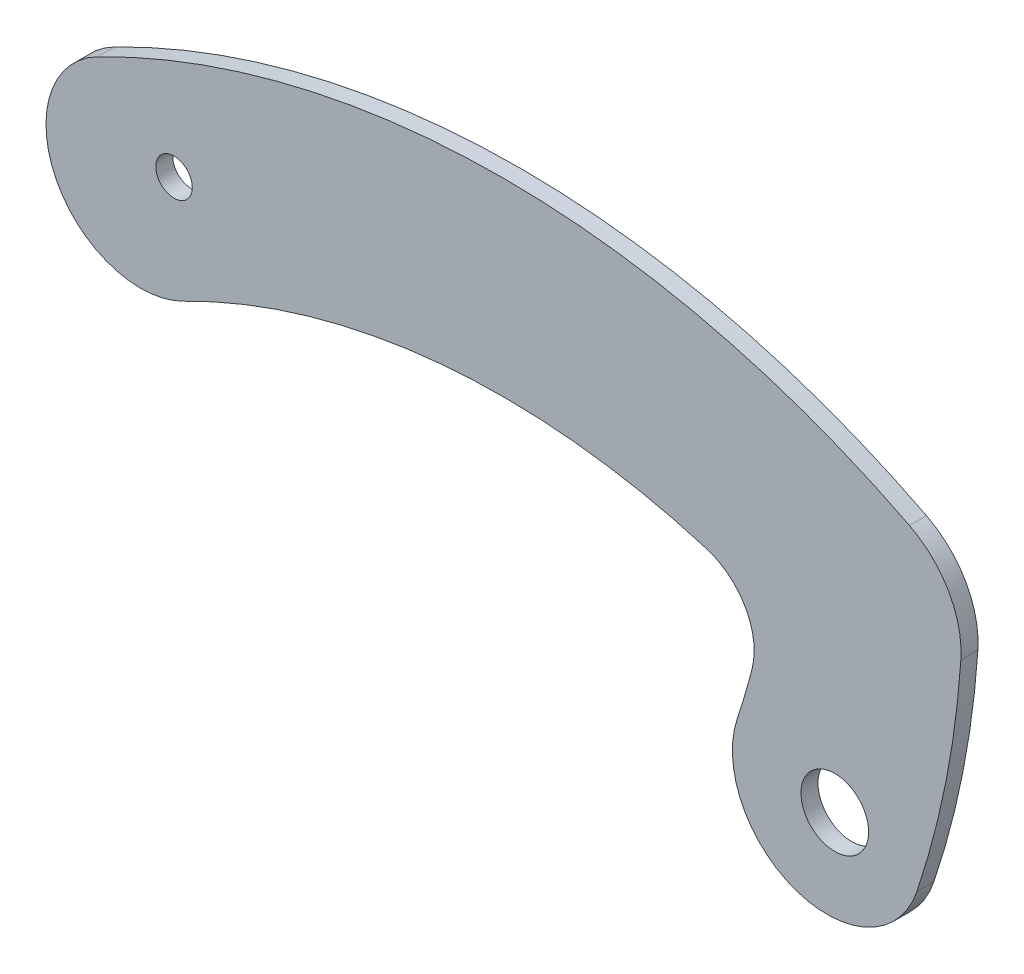
ISO-10303-21;
HEADER;
FILE_DESCRIPTION(('STEP AP214'),'2;1');
FILE_NAME('part.step','',(''),(''),'','','');
FILE_SCHEMA(('AUTOMOTIVE_DESIGN { 1 0 10303 214 1 1 1 1 }'));
ENDSEC;
DATA;
#1=APPLICATION_CONTEXT('core data for automotive mechanical design processes');
#2=APPLICATION_PROTOCOL_DEFINITION('international standard','automotive_design',2000,#1);
#3=PRODUCT_CONTEXT('',#1,'mechanical');
#4=PRODUCT('Part','Part','',(#3));
#5=PRODUCT_RELATED_PRODUCT_CATEGORY('part','',(#4));
#6=PRODUCT_DEFINITION_FORMATION('','',#4);
#7=PRODUCT_DEFINITION_CONTEXT('part definition',#1,'design');
#8=PRODUCT_DEFINITION('design','',#6,#7);
#9=PRODUCT_DEFINITION_SHAPE('','',#8);
#10=(LENGTH_UNIT() NAMED_UNIT(*) SI_UNIT(.MILLI.,.METRE.));
#11=(NAMED_UNIT(*) PLANE_ANGLE_UNIT() SI_UNIT($,.RADIAN.));
#12=(NAMED_UNIT(*) SI_UNIT($,.STERADIAN.) SOLID_ANGLE_UNIT());
#13=UNCERTAINTY_MEASURE_WITH_UNIT(LENGTH_MEASURE(1.E-05),#10,'distance_accuracy_value','');
#14=(GEOMETRIC_REPRESENTATION_CONTEXT(3) GLOBAL_UNCERTAINTY_ASSIGNED_CONTEXT((#13)) GLOBAL_UNIT_ASSIGNED_CONTEXT((#10,
#11,#12)) REPRESENTATION_CONTEXT('',''));
#15=CARTESIAN_POINT('',(0.,0.,0.));
#16=DIRECTION('',(0.,0.,1.));
#17=DIRECTION('',(1.,0.,0.));
#18=AXIS2_PLACEMENT_3D('',#15,#16,#17);
#19=CARTESIAN_POINT('',(136.301224422458,0.,3.2004));
#20=DIRECTION('',(0.,0.,-1.));
#21=DIRECTION('',(-1.,0.,0.));
#22=AXIS2_PLACEMENT_3D('',#19,#20,#21);
#23=CYLINDRICAL_SURFACE('',#22,17.7830958000237);
#24=DIRECTION('',(0.,0.,1.));
#25=VECTOR('',#24,1.);
#26=CARTESIAN_POINT('',(154.043888830047,-1.1984806850691,-84.6497383517436));
#27=LINE('',#26,#25);
#28=CARTESIAN_POINT('',(154.043888830047,-1.1984806850691,0.));
#29=VERTEX_POINT('',#28);
#30=CARTESIAN_POINT('',(154.043888830047,-1.1984806850691,3.2004));
#31=VERTEX_POINT('',#30);
#32=EDGE_CURVE('E106',#29,#31,#27,.T.);
#33=ORIENTED_EDGE('',*,*,#32,.F.);
#34=CARTESIAN_POINT('',(136.301224422458,0.,0.));
#35=DIRECTION('',(0.,0.,1.));
#36=DIRECTION('',(-1.,0.,0.));
#37=AXIS2_PLACEMENT_3D('',#34,#35,#36);
#38=CIRCLE('',#37,17.7830958000237);
#39=CARTESIAN_POINT('',(144.398322183272,15.8327352054103,0.));
#40=VERTEX_POINT('',#39);
#41=EDGE_CURVE('E103',#29,#40,#38,.T.);
#42=ORIENTED_EDGE('',*,*,#41,.T.);
#43=DIRECTION('',(0.,0.,-1.));
#44=VECTOR('',#43,1.);
#45=CARTESIAN_POINT('',(144.398322183272,15.8327352054103,3.2004));
#46=LINE('',#45,#44);
#47=CARTESIAN_POINT('',(144.398322183272,15.8327352054103,3.2004));
#48=VERTEX_POINT('',#47);
#49=EDGE_CURVE('E159',#48,#40,#46,.T.);
#50=ORIENTED_EDGE('',*,*,#49,.F.);
#51=CARTESIAN_POINT('',(136.301224422458,0.,3.2004));
#52=DIRECTION('',(0.,0.,1.));
#53=DIRECTION('',(-1.,0.,0.));
#54=AXIS2_PLACEMENT_3D('',#51,#52,#53);
#55=CIRCLE('',#54,17.7830958000237);
#56=EDGE_CURVE('E137',#31,#48,#55,.T.);
#57=ORIENTED_EDGE('',*,*,#56,.F.);
#58=EDGE_LOOP('',(#33,#42,#50,#57));
#59=FACE_BOUND('',#58,.T.);
#60=ADVANCED_FACE('F32',(#59),#23,.T.);
#61=CARTESIAN_POINT('',(68.150612211229,-133.258931669179,3.2004));
#62=DIRECTION('',(0.,0.,-1.));
#63=DIRECTION('',(-1.,0.,0.));
#64=AXIS2_PLACEMENT_3D('',#61,#62,#63);
#65=CYLINDRICAL_SURFACE('',#64,167.457571962047);
#66=CARTESIAN_POINT('',(68.150612211229,-133.258931669179,0.));
#67=DIRECTION('',(0.,0.,1.));
#68=DIRECTION('',(-1.,0.,0.));
#69=AXIS2_PLACEMENT_3D('',#66,#67,#68);
#70=CIRCLE('',#69,167.457571962047);
#71=CARTESIAN_POINT('',(-8.09709776081412,15.8327352054103,0.));
#72=VERTEX_POINT('',#71);
#73=EDGE_CURVE('E148',#40,#72,#70,.T.);
#74=ORIENTED_EDGE('',*,*,#73,.T.);
#75=DIRECTION('',(0.,0.,-1.));
#76=VECTOR('',#75,1.);
#77=CARTESIAN_POINT('',(-8.09709776081412,15.8327352054103,3.2004));
#78=LINE('',#77,#76);
#79=CARTESIAN_POINT('',(-8.09709776081412,15.8327352054103,3.2004));
#80=VERTEX_POINT('',#79);
#81=EDGE_CURVE('E156',#80,#72,#78,.T.);
#82=ORIENTED_EDGE('',*,*,#81,.F.);
#83=CARTESIAN_POINT('',(68.150612211229,-133.258931669179,3.2004));
#84=DIRECTION('',(0.,0.,1.));
#85=DIRECTION('',(-1.,0.,0.));
#86=AXIS2_PLACEMENT_3D('',#83,#84,#85);
#87=CIRCLE('',#86,167.457571962047);
#88=EDGE_CURVE('E139',#48,#80,#87,.T.);
#89=ORIENTED_EDGE('',*,*,#88,.F.);
#90=ORIENTED_EDGE('',*,*,#49,.T.);
#91=EDGE_LOOP('',(#74,#82,#89,#90));
#92=FACE_BOUND('',#91,.T.);
#93=ADVANCED_FACE('F189',(#92),#65,.T.);
#94=CARTESIAN_POINT('',(0.,0.,3.2004));
#95=DIRECTION('',(0.,0.,-1.));
#96=DIRECTION('',(-1.,0.,0.));
#97=AXIS2_PLACEMENT_3D('',#94,#95,#96);
#98=CYLINDRICAL_SURFACE('',#97,17.7830958000237);
#99=CARTESIAN_POINT('',(0.,0.,0.));
#100=DIRECTION('',(0.,0.,1.));
#101=DIRECTION('',(1.,0.,0.));
#102=AXIS2_PLACEMENT_3D('',#99,#100,#101);
#103=CIRCLE('',#102,17.7830958000237);
#104=CARTESIAN_POINT('',(8.09709776081412,-15.8327352054103,0.));
#105=VERTEX_POINT('',#104);
#106=EDGE_CURVE('E150',#72,#105,#103,.T.);
#107=ORIENTED_EDGE('',*,*,#106,.T.);
#108=DIRECTION('',(0.,0.,-1.));
#109=VECTOR('',#108,1.);
#110=CARTESIAN_POINT('',(8.09709776081412,-15.8327352054103,3.2004));
#111=LINE('',#110,#109);
#112=CARTESIAN_POINT('',(8.09709776081412,-15.8327352054103,3.2004));
#113=VERTEX_POINT('',#112);
#114=EDGE_CURVE('E146',#113,#105,#111,.T.);
#115=ORIENTED_EDGE('',*,*,#114,.F.);
#116=CARTESIAN_POINT('',(0.,0.,3.2004));
#117=DIRECTION('',(0.,0.,1.));
#118=DIRECTION('',(1.,0.,0.));
#119=AXIS2_PLACEMENT_3D('',#116,#117,#118);
#120=CIRCLE('',#119,17.7830958000237);
#121=EDGE_CURVE('E142',#80,#113,#120,.T.);
#122=ORIENTED_EDGE('',*,*,#121,.F.);
#123=ORIENTED_EDGE('',*,*,#81,.T.);
#124=EDGE_LOOP('',(#107,#115,#122,#123));
#125=FACE_BOUND('',#124,.T.);
#126=ADVANCED_FACE('F179',(#125),#98,.T.);
#127=CARTESIAN_POINT('',(68.150612211229,-133.258931669179,3.2004));
#128=DIRECTION('',(0.,0.,-1.));
#129=DIRECTION('',(-1.,0.,0.));
#130=AXIS2_PLACEMENT_3D('',#127,#128,#129);
#131=CYLINDRICAL_SURFACE('',#130,131.891380362);
#132=CARTESIAN_POINT('',(68.150612211229,-133.258931669179,0.));
#133=DIRECTION('',(0.,0.,-1.));
#134=DIRECTION('',(-1.,0.,0.));
#135=AXIS2_PLACEMENT_3D('',#132,#133,#134);
#136=CIRCLE('',#135,131.891380362);
#137=CARTESIAN_POINT('',(106.18403029329,-6.97039171883765,0.));
#138=VERTEX_POINT('',#137);
#139=EDGE_CURVE('E140',#105,#138,#136,.T.);
#140=ORIENTED_EDGE('',*,*,#139,.T.);
#141=DIRECTION('',(0.,0.,-1.));
#142=VECTOR('',#141,1.);
#143=CARTESIAN_POINT('',(106.18403029329,-6.97039171883765,3.2004));
#144=LINE('',#143,#142);
#145=CARTESIAN_POINT('',(106.18403029329,-6.97039171883765,3.2004));
#146=VERTEX_POINT('',#145);
#147=EDGE_CURVE('E162',#138,#146,#144,.F.);
#148=ORIENTED_EDGE('',*,*,#147,.T.);
#149=CARTESIAN_POINT('',(68.150612211229,-133.258931669179,3.2004));
#150=DIRECTION('',(0.,0.,-1.));
#151=DIRECTION('',(-1.,0.,0.));
#152=AXIS2_PLACEMENT_3D('',#149,#150,#151);
#153=CIRCLE('',#152,131.891380362);
#154=EDGE_CURVE('E144',#113,#146,#153,.T.);
#155=ORIENTED_EDGE('',*,*,#154,.F.);
#156=ORIENTED_EDGE('',*,*,#114,.T.);
#157=EDGE_LOOP('',(#140,#148,#155,#156));
#158=FACE_BOUND('',#157,.T.);
#159=ADVANCED_FACE('F168',(#158),#131,.F.);
#160=CARTESIAN_POINT('',(102.225918316843,-66.6294658345895,3.2004));
#161=DIRECTION('',(0.,0.,-1.));
#162=DIRECTION('',(-1.,0.,0.));
#163=AXIS2_PLACEMENT_3D('',#160,#161,#162);
#164=PLANE('',#163);
#165=CARTESIAN_POINT('',(130.361522506201,-37.8607045713044,3.2004));
#166=DIRECTION('',(0.,0.,1.));
#167=DIRECTION('',(1.,0.,0.));
#168=AXIS2_PLACEMENT_3D('',#165,#166,#167);
#169=CIRCLE('',#168,6.35);
#170=CARTESIAN_POINT('',(136.711522506201,-37.8607045713044,3.2004));
#171=VERTEX_POINT('',#170);
#172=EDGE_CURVE('E221',#171,#171,#169,.T.);
#173=ORIENTED_EDGE('',*,*,#172,.F.);
#174=EDGE_LOOP('',(#173));
#175=FACE_BOUND('',#174,.T.);
#176=CARTESIAN_POINT('',(-13.0329539898844,10.0872182630756,3.2004));
#177=DIRECTION('',(0.,0.,1.));
#178=DIRECTION('',(-1.,0.,0.));
#179=AXIS2_PLACEMENT_3D('',#176,#177,#178);
#180=CIRCLE('',#179,167.457571962047);
#181=CARTESIAN_POINT('',(145.781416871047,-43.016774199552,3.2004));
#182=VERTEX_POINT('',#181);
#183=EDGE_CURVE('E112',#182,#31,#180,.T.);
#184=ORIENTED_EDGE('',*,*,#183,.T.);
#185=ORIENTED_EDGE('',*,*,#56,.T.);
#186=ORIENTED_EDGE('',*,*,#88,.T.);
#187=ORIENTED_EDGE('',*,*,#121,.T.);
#188=ORIENTED_EDGE('',*,*,#154,.T.);
#189=CARTESIAN_POINT('',(102.521740852415,-19.1308866121903,3.20040000000001));
#190=DIRECTION('',(0.,0.,-1.));
#191=DIRECTION('',(-1.,0.,0.));
#192=AXIS2_PLACEMENT_3D('',#189,#190,#191);
#193=CIRCLE('',#192,12.7);
#194=CARTESIAN_POINT('',(114.834247176615,-22.2441145216993,3.2004));
#195=VERTEX_POINT('',#194);
#196=EDGE_CURVE('E40',#146,#195,#193,.T.);
#197=ORIENTED_EDGE('',*,*,#196,.T.);
#198=CARTESIAN_POINT('',(-13.0329539898844,10.0872182630756,3.2004));
#199=DIRECTION('',(0.,0.,-1.));
#200=DIRECTION('',(-1.,0.,0.));
#201=AXIS2_PLACEMENT_3D('',#198,#199,#200);
#202=CIRCLE('',#201,131.891380362);
#203=CARTESIAN_POINT('',(112.0509484503,-31.7380559635003,3.2004));
#204=VERTEX_POINT('',#203);
#205=EDGE_CURVE('E125',#195,#204,#202,.T.);
#206=ORIENTED_EDGE('',*,*,#205,.T.);
#207=CARTESIAN_POINT('',(128.916182660673,-37.3774150815262,3.2004));
#208=DIRECTION('',(0.,0.,1.));
#209=DIRECTION('',(1.,0.,0.));
#210=AXIS2_PLACEMENT_3D('',#207,#208,#209);
#211=CIRCLE('',#210,17.7830958000237);
#212=EDGE_CURVE('E121',#204,#182,#211,.T.);
#213=ORIENTED_EDGE('',*,*,#212,.T.);
#214=EDGE_LOOP('',(#184,#185,#186,#187,#188,#197,#206,#213));
#215=FACE_BOUND('',#214,.T.);
#216=CARTESIAN_POINT('',(6.26183634265892,3.43776081821638,3.2004));
#217=DIRECTION('',(0.,0.,1.));
#218=DIRECTION('',(1.,0.,0.));
#219=AXIS2_PLACEMENT_3D('',#216,#217,#218);
#220=CIRCLE('',#219,3.42900000000725);
#221=CARTESIAN_POINT('',(9.69083634266617,3.43776081821638,3.2004));
#222=VERTEX_POINT('',#221);
#223=EDGE_CURVE('E131',#222,#222,#220,.T.);
#224=ORIENTED_EDGE('',*,*,#223,.F.);
#225=EDGE_LOOP('',(#224));
#226=FACE_BOUND('',#225,.T.);
#227=ADVANCED_FACE('F172',(#175,#215,#226),#164,.F.);
#228=CARTESIAN_POINT('',(102.225918316843,-66.6294658345895,0.));
#229=DIRECTION('',(0.,0.,-1.));
#230=DIRECTION('',(-1.,0.,0.));
#231=AXIS2_PLACEMENT_3D('',#228,#229,#230);
#232=PLANE('',#231);
#233=CARTESIAN_POINT('',(130.361522506201,-37.8607045713044,0.));
#234=DIRECTION('',(0.,0.,-1.));
#235=DIRECTION('',(-1.,0.,0.));
#236=AXIS2_PLACEMENT_3D('',#233,#234,#235);
#237=CIRCLE('',#236,6.35);
#238=CARTESIAN_POINT('',(124.011522506201,-37.8607045713044,0.));
#239=VERTEX_POINT('',#238);
#240=EDGE_CURVE('E219',#239,#239,#237,.F.);
#241=ORIENTED_EDGE('',*,*,#240,.T.);
#242=EDGE_LOOP('',(#241));
#243=FACE_BOUND('',#242,.T.);
#244=ORIENTED_EDGE('',*,*,#41,.F.);
#245=CARTESIAN_POINT('',(-13.0329539898844,10.0872182630756,0.));
#246=DIRECTION('',(0.,0.,-1.));
#247=DIRECTION('',(-1.,0.,0.));
#248=AXIS2_PLACEMENT_3D('',#245,#246,#247);
#249=CIRCLE('',#248,167.457571962047);
#250=CARTESIAN_POINT('',(145.781416871047,-43.016774199552,0.));
#251=VERTEX_POINT('',#250);
#252=EDGE_CURVE('E95',#251,#29,#249,.F.);
#253=ORIENTED_EDGE('',*,*,#252,.F.);
#254=CARTESIAN_POINT('',(128.916182660673,-37.3774150815262,0.));
#255=DIRECTION('',(0.,0.,-1.));
#256=DIRECTION('',(-1.,0.,0.));
#257=AXIS2_PLACEMENT_3D('',#254,#255,#256);
#258=CIRCLE('',#257,17.7830958000237);
#259=CARTESIAN_POINT('',(112.0509484503,-31.7380559635003,0.));
#260=VERTEX_POINT('',#259);
#261=EDGE_CURVE('E100',#260,#251,#258,.F.);
#262=ORIENTED_EDGE('',*,*,#261,.F.);
#263=CARTESIAN_POINT('',(-13.0329539898844,10.0872182630756,0.));
#264=DIRECTION('',(0.,0.,-1.));
#265=DIRECTION('',(-1.,0.,0.));
#266=AXIS2_PLACEMENT_3D('',#263,#264,#265);
#267=CIRCLE('',#266,131.891380362);
#268=CARTESIAN_POINT('',(114.834247176615,-22.2441145216993,0.));
#269=VERTEX_POINT('',#268);
#270=EDGE_CURVE('E127',#269,#260,#267,.T.);
#271=ORIENTED_EDGE('',*,*,#270,.F.);
#272=CARTESIAN_POINT('',(102.521740852415,-19.1308866121903,0.));
#273=DIRECTION('',(0.,0.,-1.));
#274=DIRECTION('',(-1.,0.,0.));
#275=AXIS2_PLACEMENT_3D('',#272,#273,#274);
#276=CIRCLE('',#275,12.7);
#277=EDGE_CURVE('E11',#269,#138,#276,.F.);
#278=ORIENTED_EDGE('',*,*,#277,.T.);
#279=ORIENTED_EDGE('',*,*,#139,.F.);
#280=ORIENTED_EDGE('',*,*,#106,.F.);
#281=ORIENTED_EDGE('',*,*,#73,.F.);
#282=EDGE_LOOP('',(#244,#253,#262,#271,#278,#279,#280,#281));
#283=FACE_BOUND('',#282,.T.);
#284=CARTESIAN_POINT('',(6.26183634265892,3.43776081821638,0.));
#285=DIRECTION('',(0.,0.,-1.));
#286=DIRECTION('',(-1.,0.,0.));
#287=AXIS2_PLACEMENT_3D('',#284,#285,#286);
#288=CIRCLE('',#287,3.42900000000725);
#289=CARTESIAN_POINT('',(2.83283634265168,3.43776081821638,0.));
#290=VERTEX_POINT('',#289);
#291=EDGE_CURVE('E134',#290,#290,#288,.F.);
#292=ORIENTED_EDGE('',*,*,#291,.T.);
#293=EDGE_LOOP('',(#292));
#294=FACE_BOUND('',#293,.T.);
#295=ADVANCED_FACE('F97',(#243,#283,#294),#232,.T.);
#296=CARTESIAN_POINT('',(6.26183634265892,3.43776081821638,-9.69867661077519));
#297=DIRECTION('',(0.,0.,1.));
#298=DIRECTION('',(1.,0.,0.));
#299=AXIS2_PLACEMENT_3D('',#296,#297,#298);
#300=CYLINDRICAL_SURFACE('',#299,3.42900000000725);
#301=ORIENTED_EDGE('',*,*,#223,.T.);
#302=EDGE_LOOP('',(#301));
#303=FACE_BOUND('',#302,.T.);
#304=ORIENTED_EDGE('',*,*,#291,.F.);
#305=EDGE_LOOP('',(#304));
#306=FACE_BOUND('',#305,.T.);
#307=ADVANCED_FACE('F203',(#303,#306),#300,.F.);
#308=CARTESIAN_POINT('',(-13.0329539898844,10.0872182630756,-84.6497383517436));
#309=DIRECTION('',(0.,0.,1.));
#310=DIRECTION('',(1.,0.,0.));
#311=AXIS2_PLACEMENT_3D('',#308,#309,#310);
#312=CYLINDRICAL_SURFACE('',#311,131.891380362);
#313=ORIENTED_EDGE('',*,*,#205,.F.);
#314=DIRECTION('',(0.,0.,1.));
#315=VECTOR('',#314,1.);
#316=CARTESIAN_POINT('',(114.834247176615,-22.2441145216993,-84.6497383517436));
#317=LINE('',#316,#315);
#318=EDGE_CURVE('E53',#195,#269,#317,.F.);
#319=ORIENTED_EDGE('',*,*,#318,.T.);
#320=ORIENTED_EDGE('',*,*,#270,.T.);
#321=DIRECTION('',(0.,0.,1.));
#322=VECTOR('',#321,1.);
#323=CARTESIAN_POINT('',(112.0509484503,-31.7380559635003,-84.6497383517436));
#324=LINE('',#323,#322);
#325=EDGE_CURVE('E119',#260,#204,#324,.T.);
#326=ORIENTED_EDGE('',*,*,#325,.T.);
#327=EDGE_LOOP('',(#313,#319,#320,#326));
#328=FACE_BOUND('',#327,.T.);
#329=ADVANCED_FACE('F210',(#328),#312,.F.);
#330=CARTESIAN_POINT('',(128.916182660673,-37.3774150815262,-84.6497383517436));
#331=DIRECTION('',(0.,0.,1.));
#332=DIRECTION('',(1.,0.,0.));
#333=AXIS2_PLACEMENT_3D('',#330,#331,#332);
#334=CYLINDRICAL_SURFACE('',#333,17.7830958000237);
#335=ORIENTED_EDGE('',*,*,#325,.F.);
#336=ORIENTED_EDGE('',*,*,#261,.T.);
#337=DIRECTION('',(0.,0.,1.));
#338=VECTOR('',#337,1.);
#339=CARTESIAN_POINT('',(145.781416871047,-43.016774199552,-84.6497383517436));
#340=LINE('',#339,#338);
#341=EDGE_CURVE('E107',#251,#182,#340,.T.);
#342=ORIENTED_EDGE('',*,*,#341,.T.);
#343=ORIENTED_EDGE('',*,*,#212,.F.);
#344=EDGE_LOOP('',(#335,#336,#342,#343));
#345=FACE_BOUND('',#344,.T.);
#346=ADVANCED_FACE('F117',(#345),#334,.T.);
#347=CARTESIAN_POINT('',(-13.0329539898844,10.0872182630756,-84.6497383517436));
#348=DIRECTION('',(0.,0.,1.));
#349=DIRECTION('',(1.,0.,0.));
#350=AXIS2_PLACEMENT_3D('',#347,#348,#349);
#351=CYLINDRICAL_SURFACE('',#350,167.457571962047);
#352=ORIENTED_EDGE('',*,*,#341,.F.);
#353=ORIENTED_EDGE('',*,*,#252,.T.);
#354=ORIENTED_EDGE('',*,*,#32,.T.);
#355=ORIENTED_EDGE('',*,*,#183,.F.);
#356=EDGE_LOOP('',(#352,#353,#354,#355));
#357=FACE_BOUND('',#356,.T.);
#358=ADVANCED_FACE('F110',(#357),#351,.T.);
#359=CARTESIAN_POINT('',(130.361522506201,-37.8607045713044,-17.9605122421383));
#360=DIRECTION('',(0.,0.,1.));
#361=DIRECTION('',(1.,0.,0.));
#362=AXIS2_PLACEMENT_3D('',#359,#360,#361);
#363=CYLINDRICAL_SURFACE('',#362,6.35);
#364=ORIENTED_EDGE('',*,*,#172,.T.);
#365=EDGE_LOOP('',(#364));
#366=FACE_BOUND('',#365,.T.);
#367=ORIENTED_EDGE('',*,*,#240,.F.);
#368=EDGE_LOOP('',(#367));
#369=FACE_BOUND('',#368,.T.);
#370=ADVANCED_FACE('F182',(#366,#369),#363,.F.);
#371=CARTESIAN_POINT('',(102.521740852415,-19.1308866121903,-84.6497383517436));
#372=DIRECTION('',(0.,0.,-1.));
#373=DIRECTION('',(-1.,0.,0.));
#374=AXIS2_PLACEMENT_3D('',#371,#372,#373);
#375=CYLINDRICAL_SURFACE('',#374,12.7);
#376=ORIENTED_EDGE('',*,*,#277,.F.);
#377=ORIENTED_EDGE('',*,*,#318,.F.);
#378=ORIENTED_EDGE('',*,*,#196,.F.);
#379=ORIENTED_EDGE('',*,*,#147,.F.);
#380=EDGE_LOOP('',(#376,#377,#378,#379));
#381=FACE_BOUND('',#380,.T.);
#382=ADVANCED_FACE('F34',(#381),#375,.F.);
#383=CLOSED_SHELL('',(#60,#93,#126,#159,#227,#295,#307,#329,#346,#358,#370,#382));
#384=MANIFOLD_SOLID_BREP('B2',#383);
#385=ADVANCED_BREP_SHAPE_REPRESENTATION('',(#18,#384),#14);
#386=SHAPE_DEFINITION_REPRESENTATION(#9,#385);
ENDSEC;
END-ISO-10303-21;
